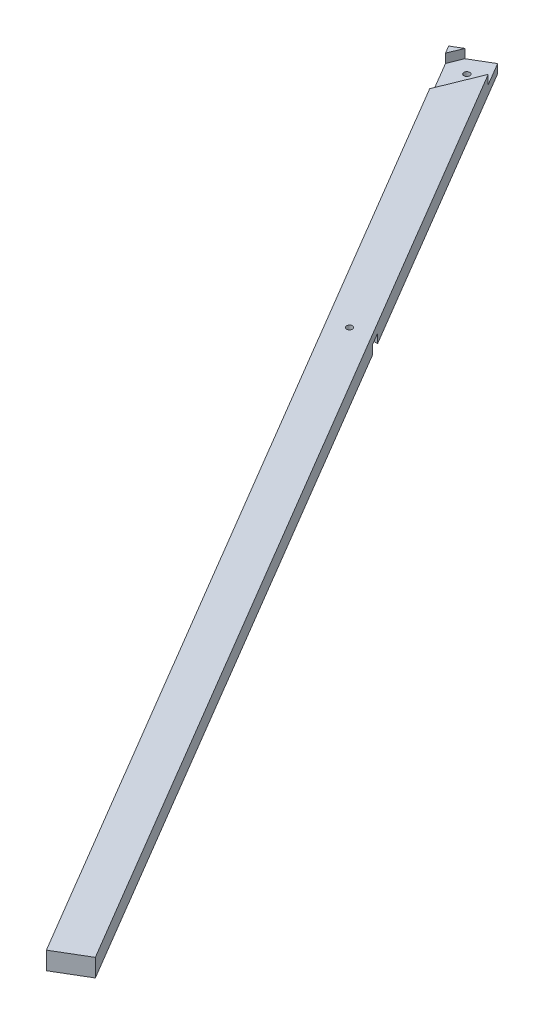
ISO-10303-21;
HEADER;
FILE_DESCRIPTION(('STEP AP214'),'2;1');
FILE_NAME('part.step','',(''),(''),'','','');
FILE_SCHEMA(('AUTOMOTIVE_DESIGN { 1 0 10303 214 1 1 1 1 }'));
ENDSEC;
DATA;
#1=APPLICATION_CONTEXT('core data for automotive mechanical design processes');
#2=APPLICATION_PROTOCOL_DEFINITION('international standard','automotive_design',2000,#1);
#3=PRODUCT_CONTEXT('',#1,'mechanical');
#4=PRODUCT('Part','Part','',(#3));
#5=PRODUCT_RELATED_PRODUCT_CATEGORY('part','',(#4));
#6=PRODUCT_DEFINITION_FORMATION('','',#4);
#7=PRODUCT_DEFINITION_CONTEXT('part definition',#1,'design');
#8=PRODUCT_DEFINITION('design','',#6,#7);
#9=PRODUCT_DEFINITION_SHAPE('','',#8);
#10=(LENGTH_UNIT() NAMED_UNIT(*) SI_UNIT(.MILLI.,.METRE.));
#11=(NAMED_UNIT(*) PLANE_ANGLE_UNIT() SI_UNIT($,.RADIAN.));
#12=(NAMED_UNIT(*) SI_UNIT($,.STERADIAN.) SOLID_ANGLE_UNIT());
#13=UNCERTAINTY_MEASURE_WITH_UNIT(LENGTH_MEASURE(1.E-05),#10,'distance_accuracy_value','');
#14=(GEOMETRIC_REPRESENTATION_CONTEXT(3) GLOBAL_UNCERTAINTY_ASSIGNED_CONTEXT((#13)) GLOBAL_UNIT_ASSIGNED_CONTEXT((#10,
#11,#12)) REPRESENTATION_CONTEXT('',''));
#15=CARTESIAN_POINT('',(0.,0.,0.));
#16=DIRECTION('',(0.,0.,1.));
#17=DIRECTION('',(1.,0.,0.));
#18=AXIS2_PLACEMENT_3D('',#15,#16,#17);
#19=CARTESIAN_POINT('',(0.,0.,0.));
#20=DIRECTION('',(0.,1.,0.));
#21=DIRECTION('',(0.,0.,1.));
#22=AXIS2_PLACEMENT_3D('',#19,#20,#21);
#23=PLANE('',#22);
#24=CARTESIAN_POINT('',(-200.025,0.,-287.053592554873));
#25=DIRECTION('',(0.,-1.,0.));
#26=DIRECTION('',(0.,0.,-1.));
#27=AXIS2_PLACEMENT_3D('',#24,#25,#26);
#28=CIRCLE('',#27,3.17500000000002);
#29=CARTESIAN_POINT('',(-200.025,0.,-290.228592554874));
#30=VERTEX_POINT('',#29);
#31=EDGE_CURVE('E234',#30,#30,#28,.T.);
#32=ORIENTED_EDGE('',*,*,#31,.F.);
#33=EDGE_LOOP('',(#32));
#34=FACE_BOUND('',#33,.T.);
#35=DIRECTION('',(-0.508928571428564,0.,-0.860808752966465));
#36=VECTOR('',#35,1.);
#37=CARTESIAN_POINT('',(0.,0.,13.8398518478836));
#38=LINE('',#37,#36);
#39=CARTESIAN_POINT('',(-8.18241683237236,0.,0.));
#40=VERTEX_POINT('',#39);
#41=CARTESIAN_POINT('',(-193.321682541703,0.,-313.147088584599));
#42=VERTEX_POINT('',#41);
#43=EDGE_CURVE('E225',#40,#42,#38,.T.);
#44=ORIENTED_EDGE('',*,*,#43,.F.);
#45=DIRECTION('',(1.,0.,0.));
#46=VECTOR('',#45,1.);
#47=CARTESIAN_POINT('',(-8.18241683237236,0.,0.));
#48=LINE('',#47,#46);
#49=CARTESIAN_POINT('',(-52.4431191878053,0.,0.));
#50=VERTEX_POINT('',#49);
#51=EDGE_CURVE('E136',#50,#40,#48,.T.);
#52=ORIENTED_EDGE('',*,*,#51,.F.);
#53=DIRECTION('',(0.508928571428569,0.,0.860808752966462));
#54=VECTOR('',#53,1.);
#55=CARTESIAN_POINT('',(-29.9175831676298,0.,38.1000000000001));
#56=LINE('',#55,#54);
#57=CARTESIAN_POINT('',(-226.118496029725,0.,-293.75691001317));
#58=VERTEX_POINT('',#57);
#59=EDGE_CURVE('E219',#58,#50,#56,.T.);
#60=ORIENTED_EDGE('',*,*,#59,.F.);
#61=DIRECTION('',(-0.860808752966463,0.,0.508928571428568));
#62=VECTOR('',#61,1.);
#63=CARTESIAN_POINT('',(-193.321682541703,0.,-313.147088584599));
#64=LINE('',#63,#62);
#65=EDGE_CURVE('E195',#42,#58,#64,.T.);
#66=ORIENTED_EDGE('',*,*,#65,.F.);
#67=EDGE_LOOP('',(#44,#52,#60,#66));
#68=FACE_BOUND('',#67,.T.);
#69=ADVANCED_FACE('F33',(#34,#68),#23,.F.);
#70=CARTESIAN_POINT('',(0.,19.05,0.));
#71=DIRECTION('',(0.,1.,0.));
#72=DIRECTION('',(0.,0.,1.));
#73=AXIS2_PLACEMENT_3D('',#70,#71,#72);
#74=PLANE('',#73);
#75=DIRECTION('',(-0.375000000000001,0.,0.927024810886958));
#76=VECTOR('',#75,1.);
#77=CARTESIAN_POINT('',(-289.345982904623,19.05,-117.046213127153));
#78=LINE('',#77,#76);
#79=CARTESIAN_POINT('',(-215.267964048959,19.05,-300.171976915291));
#80=VERTEX_POINT('',#79);
#81=CARTESIAN_POINT('',(-221.216787176876,19.05,-285.466092554874));
#82=VERTEX_POINT('',#81);
#83=EDGE_CURVE('E180',#80,#82,#78,.T.);
#84=ORIENTED_EDGE('',*,*,#83,.F.);
#85=DIRECTION('',(-0.860808752966463,0.,0.508928571428568));
#86=VECTOR('',#85,1.);
#87=CARTESIAN_POINT('',(-193.321682541703,19.05,-313.147088584599));
#88=LINE('',#87,#86);
#89=CARTESIAN_POINT('',(-226.118496029725,19.05,-293.75691001317));
#90=VERTEX_POINT('',#89);
#91=EDGE_CURVE('E205',#80,#90,#88,.T.);
#92=ORIENTED_EDGE('',*,*,#91,.T.);
#93=DIRECTION('',(0.508928571428569,0.,0.860808752966462));
#94=VECTOR('',#93,1.);
#95=CARTESIAN_POINT('',(-226.118496029725,19.05,-293.75691001317));
#96=LINE('',#95,#94);
#97=EDGE_CURVE('E209',#90,#82,#96,.T.);
#98=ORIENTED_EDGE('',*,*,#97,.T.);
#99=EDGE_LOOP('',(#84,#92,#98));
#100=FACE_BOUND('',#99,.T.);
#101=ADVANCED_FACE('F259',(#100),#74,.T.);
#102=CARTESIAN_POINT('',(-193.321682541703,19.05,-313.147088584599));
#103=DIRECTION('',(0.508928571428568,0.,0.860808752966463));
#104=DIRECTION('',(0.860808752966463,0.,-0.508928571428568));
#105=AXIS2_PLACEMENT_3D('',#102,#103,#104);
#106=PLANE('',#105);
#107=ORIENTED_EDGE('',*,*,#91,.F.);
#108=DIRECTION('',(0.,1.,0.));
#109=VECTOR('',#108,1.);
#110=CARTESIAN_POINT('',(-215.267964048959,9.525,-300.171976915291));
#111=LINE('',#110,#109);
#112=CARTESIAN_POINT('',(-215.267964048959,9.525,-300.171976915291));
#113=VERTEX_POINT('',#112);
#114=EDGE_CURVE('E196',#113,#80,#111,.T.);
#115=ORIENTED_EDGE('',*,*,#114,.F.);
#116=DIRECTION('',(-0.860808752966463,0.,0.508928571428568));
#117=VECTOR('',#116,1.);
#118=CARTESIAN_POINT('',(-187.25857950783,9.525,-316.73172495687));
#119=LINE('',#118,#117);
#120=CARTESIAN_POINT('',(-193.321682541703,9.525,-313.147088584599));
#121=VERTEX_POINT('',#120);
#122=EDGE_CURVE('E185',#121,#113,#119,.T.);
#123=ORIENTED_EDGE('',*,*,#122,.F.);
#124=DIRECTION('',(0.,-1.,0.));
#125=VECTOR('',#124,1.);
#126=CARTESIAN_POINT('',(-193.321682541703,19.05,-313.147088584599));
#127=LINE('',#126,#125);
#128=EDGE_CURVE('E11',#121,#42,#127,.T.);
#129=ORIENTED_EDGE('',*,*,#128,.T.);
#130=ORIENTED_EDGE('',*,*,#65,.T.);
#131=DIRECTION('',(0.,-1.,0.));
#132=VECTOR('',#131,1.);
#133=CARTESIAN_POINT('',(-226.118496029725,19.05,-293.75691001317));
#134=LINE('',#133,#132);
#135=EDGE_CURVE('E42',#90,#58,#134,.T.);
#136=ORIENTED_EDGE('',*,*,#135,.F.);
#137=EDGE_LOOP('',(#107,#115,#123,#129,#130,#136));
#138=FACE_BOUND('',#137,.T.);
#139=ADVANCED_FACE('F35',(#138),#106,.F.);
#140=CARTESIAN_POINT('',(-29.9175831676298,19.05,38.1000000000001));
#141=DIRECTION('',(0.860808752966462,0.,-0.508928571428569));
#142=DIRECTION('',(-0.508928571428569,0.,-0.860808752966462));
#143=AXIS2_PLACEMENT_3D('',#140,#141,#142);
#144=PLANE('',#143);
#145=ORIENTED_EDGE('',*,*,#59,.T.);
#146=DIRECTION('',(0.,-1.,0.));
#147=VECTOR('',#146,1.);
#148=CARTESIAN_POINT('',(-52.4431191878053,9.525,0.));
#149=LINE('',#148,#147);
#150=CARTESIAN_POINT('',(-52.4431191878053,9.525,0.));
#151=VERTEX_POINT('',#150);
#152=EDGE_CURVE('E167',#151,#50,#149,.T.);
#153=ORIENTED_EDGE('',*,*,#152,.F.);
#154=DIRECTION('',(-0.508928571428568,0.,-0.860808752966463));
#155=VECTOR('',#154,1.);
#156=CARTESIAN_POINT('',(-52.4431191878053,9.525,0.));
#157=LINE('',#156,#155);
#158=CARTESIAN_POINT('',(-29.9175831676298,9.525,38.1000000000001));
#159=VERTEX_POINT('',#158);
#160=EDGE_CURVE('E140',#159,#151,#157,.T.);
#161=ORIENTED_EDGE('',*,*,#160,.F.);
#162=DIRECTION('',(0.,-1.,0.));
#163=VECTOR('',#162,1.);
#164=CARTESIAN_POINT('',(-29.9175831676298,9.525,38.1000000000001));
#165=LINE('',#164,#163);
#166=CARTESIAN_POINT('',(-29.9175831676298,0.,38.1000000000001));
#167=VERTEX_POINT('',#166);
#168=EDGE_CURVE('E170',#159,#167,#165,.T.);
#169=ORIENTED_EDGE('',*,*,#168,.T.);
#170=CARTESIAN_POINT('',(394.367218255986,0.,755.741121603541));
#171=VERTEX_POINT('',#170);
#172=EDGE_CURVE('E218',#167,#171,#56,.T.);
#173=ORIENTED_EDGE('',*,*,#172,.T.);
#174=DIRECTION('',(0.,-1.,0.));
#175=VECTOR('',#174,1.);
#176=CARTESIAN_POINT('',(394.367218255986,19.05,755.741121603541));
#177=LINE('',#176,#175);
#178=CARTESIAN_POINT('',(394.367218255986,19.05,755.741121603541));
#179=VERTEX_POINT('',#178);
#180=EDGE_CURVE('E229',#179,#171,#177,.T.);
#181=ORIENTED_EDGE('',*,*,#180,.F.);
#182=CARTESIAN_POINT('',(-196.814123155019,19.05,-244.191092554873));
#183=VERTEX_POINT('',#182);
#184=EDGE_CURVE('E208',#183,#179,#96,.T.);
#185=ORIENTED_EDGE('',*,*,#184,.F.);
#186=DIRECTION('',(0.,1.,0.));
#187=VECTOR('',#186,1.);
#188=CARTESIAN_POINT('',(-196.814123155019,9.525,-244.191092554873));
#189=LINE('',#188,#187);
#190=CARTESIAN_POINT('',(-196.814123155019,9.525,-244.191092554873));
#191=VERTEX_POINT('',#190);
#192=EDGE_CURVE('E58',#191,#183,#189,.T.);
#193=ORIENTED_EDGE('',*,*,#192,.F.);
#194=DIRECTION('',(0.508928571428569,0.,0.860808752966462));
#195=VECTOR('',#194,1.);
#196=CARTESIAN_POINT('',(-38.8599165218951,9.525,22.9748149436999));
#197=LINE('',#196,#195);
#198=CARTESIAN_POINT('',(-221.216787176876,9.525,-285.466092554874));
#199=VERTEX_POINT('',#198);
#200=EDGE_CURVE('E176',#199,#191,#197,.T.);
#201=ORIENTED_EDGE('',*,*,#200,.F.);
#202=DIRECTION('',(0.,1.,0.));
#203=VECTOR('',#202,1.);
#204=CARTESIAN_POINT('',(-221.216787176876,9.525,-285.466092554874));
#205=LINE('',#204,#203);
#206=EDGE_CURVE('E192',#199,#82,#205,.T.);
#207=ORIENTED_EDGE('',*,*,#206,.T.);
#208=ORIENTED_EDGE('',*,*,#97,.F.);
#209=ORIENTED_EDGE('',*,*,#135,.T.);
#210=EDGE_LOOP('',(#145,#153,#161,#169,#173,#181,#185,#193,#201,#207,#208,#209));
#211=FACE_BOUND('',#210,.T.);
#212=ADVANCED_FACE('F285',(#211),#144,.F.);
#213=CARTESIAN_POINT('',(394.367218255986,19.05,755.741121603541));
#214=DIRECTION('',(-0.50892857142857,0.,-0.860808752966462));
#215=DIRECTION('',(-0.860808752966462,0.,0.50892857142857));
#216=AXIS2_PLACEMENT_3D('',#213,#214,#215);
#217=PLANE('',#216);
#218=DIRECTION('',(0.860808752966462,0.,-0.50892857142857));
#219=VECTOR('',#218,1.);
#220=CARTESIAN_POINT('',(394.367218255986,0.,755.741121603541));
#221=LINE('',#220,#219);
#222=CARTESIAN_POINT('',(427.164031744008,0.,736.350943032112));
#223=VERTEX_POINT('',#222);
#224=EDGE_CURVE('E222',#171,#223,#221,.T.);
#225=ORIENTED_EDGE('',*,*,#224,.T.);
#226=DIRECTION('',(0.,-1.,0.));
#227=VECTOR('',#226,1.);
#228=CARTESIAN_POINT('',(427.164031744008,19.05,736.350943032112));
#229=LINE('',#228,#227);
#230=CARTESIAN_POINT('',(427.164031744008,19.05,736.350943032112));
#231=VERTEX_POINT('',#230);
#232=EDGE_CURVE('E215',#231,#223,#229,.T.);
#233=ORIENTED_EDGE('',*,*,#232,.F.);
#234=DIRECTION('',(0.860808752966462,0.,-0.50892857142857));
#235=VECTOR('',#234,1.);
#236=CARTESIAN_POINT('',(394.367218255986,19.05,755.741121603541));
#237=LINE('',#236,#235);
#238=EDGE_CURVE('E212',#179,#231,#237,.T.);
#239=ORIENTED_EDGE('',*,*,#238,.F.);
#240=ORIENTED_EDGE('',*,*,#180,.T.);
#241=EDGE_LOOP('',(#225,#233,#239,#240));
#242=FACE_BOUND('',#241,.T.);
#243=ADVANCED_FACE('F289',(#242),#217,.F.);
#244=CARTESIAN_POINT('',(0.,19.05,13.8398518478836));
#245=DIRECTION('',(-0.860808752966465,0.,0.508928571428564));
#246=DIRECTION('',(0.508928571428564,0.,0.860808752966465));
#247=AXIS2_PLACEMENT_3D('',#244,#245,#246);
#248=PLANE('',#247);
#249=DIRECTION('',(0.508928571428564,0.,0.860808752966465));
#250=VECTOR('',#249,1.);
#251=CARTESIAN_POINT('',(0.,9.525,13.8398518478836));
#252=LINE('',#251,#250);
#253=CARTESIAN_POINT('',(-8.18241683237236,9.525,0.));
#254=VERTEX_POINT('',#253);
#255=CARTESIAN_POINT('',(0.,9.525,13.8398518478836));
#256=VERTEX_POINT('',#255);
#257=EDGE_CURVE('E146',#254,#256,#252,.T.);
#258=ORIENTED_EDGE('',*,*,#257,.F.);
#259=DIRECTION('',(0.,-1.,0.));
#260=VECTOR('',#259,1.);
#261=CARTESIAN_POINT('',(-8.18241683237236,9.525,0.));
#262=LINE('',#261,#260);
#263=EDGE_CURVE('E130',#254,#40,#262,.T.);
#264=ORIENTED_EDGE('',*,*,#263,.T.);
#265=ORIENTED_EDGE('',*,*,#43,.T.);
#266=ORIENTED_EDGE('',*,*,#128,.F.);
#267=DIRECTION('',(-0.508928571428569,0.,-0.860808752966462));
#268=VECTOR('',#267,1.);
#269=CARTESIAN_POINT('',(-6.0631030338729,9.525,3.58463637227139));
#270=LINE('',#269,#268);
#271=CARTESIAN_POINT('',(-178.833212823124,9.525,-288.641092554873));
#272=VERTEX_POINT('',#271);
#273=EDGE_CURVE('E183',#272,#121,#270,.T.);
#274=ORIENTED_EDGE('',*,*,#273,.F.);
#275=DIRECTION('',(0.,1.,0.));
#276=VECTOR('',#275,1.);
#277=CARTESIAN_POINT('',(-178.833212823124,9.525,-288.641092554873));
#278=LINE('',#277,#276);
#279=CARTESIAN_POINT('',(-178.833212823124,19.05,-288.641092554873));
#280=VERTEX_POINT('',#279);
#281=EDGE_CURVE('E198',#272,#280,#278,.T.);
#282=ORIENTED_EDGE('',*,*,#281,.T.);
#283=DIRECTION('',(-0.508928571428569,0.,-0.860808752966462));
#284=VECTOR('',#283,1.);
#285=CARTESIAN_POINT('',(-8.18241683237236,19.05,0.));
#286=LINE('',#285,#284);
#287=EDGE_CURVE('E202',#231,#280,#286,.T.);
#288=ORIENTED_EDGE('',*,*,#287,.F.);
#289=ORIENTED_EDGE('',*,*,#232,.T.);
#290=CARTESIAN_POINT('',(0.,0.,13.8398518478836));
#291=VERTEX_POINT('',#290);
#292=EDGE_CURVE('E206',#223,#291,#38,.T.);
#293=ORIENTED_EDGE('',*,*,#292,.T.);
#294=DIRECTION('',(0.,-1.,0.));
#295=VECTOR('',#294,1.);
#296=CARTESIAN_POINT('',(0.,9.525,13.8398518478836));
#297=LINE('',#296,#295);
#298=EDGE_CURVE('E50',#256,#291,#297,.T.);
#299=ORIENTED_EDGE('',*,*,#298,.F.);
#300=EDGE_LOOP('',(#258,#264,#265,#266,#274,#282,#288,#289,#293,#299));
#301=FACE_BOUND('',#300,.T.);
#302=ADVANCED_FACE('F152',(#301),#248,.F.);
#303=CARTESIAN_POINT('',(-19.05,19.05,19.05));
#304=DIRECTION('',(0.,-1.,0.));
#305=DIRECTION('',(0.,0.,-1.));
#306=AXIS2_PLACEMENT_3D('',#303,#304,#305);
#307=CIRCLE('',#306,3.175);
#308=CARTESIAN_POINT('',(-19.05,19.05,15.875));
#309=VERTEX_POINT('',#308);
#310=EDGE_CURVE('E241',#309,#309,#307,.T.);
#311=ORIENTED_EDGE('',*,*,#310,.T.);
#312=EDGE_LOOP('',(#311));
#313=FACE_BOUND('',#312,.T.);
#314=DIRECTION('',(0.375,0.,-0.927024810886958));
#315=VECTOR('',#314,1.);
#316=CARTESIAN_POINT('',(-254.02633760983,19.05,-102.758713127153));
#317=LINE('',#316,#315);
#318=EDGE_CURVE('E169',#183,#280,#317,.T.);
#319=ORIENTED_EDGE('',*,*,#318,.F.);
#320=ORIENTED_EDGE('',*,*,#184,.T.);
#321=ORIENTED_EDGE('',*,*,#238,.T.);
#322=ORIENTED_EDGE('',*,*,#287,.T.);
#323=EDGE_LOOP('',(#319,#320,#321,#322));
#324=FACE_BOUND('',#323,.T.);
#325=ADVANCED_FACE('F246',(#313,#324),#74,.T.);
#326=ORIENTED_EDGE('',*,*,#172,.F.);
#327=DIRECTION('',(-1.,0.,0.));
#328=VECTOR('',#327,1.);
#329=CARTESIAN_POINT('',(-29.9175831676298,0.,38.1000000000001));
#330=LINE('',#329,#328);
#331=CARTESIAN_POINT('',(0.,0.,38.1));
#332=VERTEX_POINT('',#331);
#333=EDGE_CURVE('E150',#332,#167,#330,.T.);
#334=ORIENTED_EDGE('',*,*,#333,.F.);
#335=DIRECTION('',(0.,0.,1.));
#336=VECTOR('',#335,1.);
#337=CARTESIAN_POINT('',(0.,0.,38.1));
#338=LINE('',#337,#336);
#339=EDGE_CURVE('E163',#291,#332,#338,.T.);
#340=ORIENTED_EDGE('',*,*,#339,.F.);
#341=ORIENTED_EDGE('',*,*,#292,.F.);
#342=ORIENTED_EDGE('',*,*,#224,.F.);
#343=EDGE_LOOP('',(#326,#334,#340,#341,#342));
#344=FACE_BOUND('',#343,.T.);
#345=ADVANCED_FACE('F262',(#344),#23,.F.);
#346=CARTESIAN_POINT('',(-289.345982904623,9.525,-117.046213127153));
#347=DIRECTION('',(-0.927024810886958,0.,-0.375000000000001));
#348=DIRECTION('',(-0.375000000000001,0.,0.927024810886958));
#349=AXIS2_PLACEMENT_3D('',#346,#347,#348);
#350=PLANE('',#349);
#351=ORIENTED_EDGE('',*,*,#83,.T.);
#352=ORIENTED_EDGE('',*,*,#206,.F.);
#353=DIRECTION('',(-0.375000000000001,0.,0.927024810886958));
#354=VECTOR('',#353,1.);
#355=CARTESIAN_POINT('',(-289.345982904623,9.525,-117.046213127153));
#356=LINE('',#355,#354);
#357=EDGE_CURVE('E187',#113,#199,#356,.T.);
#358=ORIENTED_EDGE('',*,*,#357,.F.);
#359=ORIENTED_EDGE('',*,*,#114,.T.);
#360=EDGE_LOOP('',(#351,#352,#358,#359));
#361=FACE_BOUND('',#360,.T.);
#362=ADVANCED_FACE('F271',(#361),#350,.F.);
#363=CARTESIAN_POINT('',(-254.02633760983,9.525,-102.758713127153));
#364=DIRECTION('',(0.927024810886958,0.,0.375));
#365=DIRECTION('',(0.375,0.,-0.927024810886958));
#366=AXIS2_PLACEMENT_3D('',#363,#364,#365);
#367=PLANE('',#366);
#368=ORIENTED_EDGE('',*,*,#318,.T.);
#369=ORIENTED_EDGE('',*,*,#281,.F.);
#370=DIRECTION('',(0.375,0.,-0.927024810886958));
#371=VECTOR('',#370,1.);
#372=CARTESIAN_POINT('',(-254.02633760983,9.525,-102.758713127153));
#373=LINE('',#372,#371);
#374=EDGE_CURVE('E179',#191,#272,#373,.T.);
#375=ORIENTED_EDGE('',*,*,#374,.F.);
#376=ORIENTED_EDGE('',*,*,#192,.T.);
#377=EDGE_LOOP('',(#368,#369,#375,#376));
#378=FACE_BOUND('',#377,.T.);
#379=ADVANCED_FACE('F277',(#378),#367,.F.);
#380=CARTESIAN_POINT('',(0.,9.525,0.));
#381=DIRECTION('',(0.,1.,0.));
#382=DIRECTION('',(0.,0.,1.));
#383=AXIS2_PLACEMENT_3D('',#380,#381,#382);
#384=PLANE('',#383);
#385=CARTESIAN_POINT('',(-200.025,9.525,-287.053592554873));
#386=DIRECTION('',(0.,1.,0.));
#387=DIRECTION('',(0.,0.,1.));
#388=AXIS2_PLACEMENT_3D('',#385,#386,#387);
#389=CIRCLE('',#388,3.17500000000002);
#390=CARTESIAN_POINT('',(-200.025,9.525,-290.228592554874));
#391=VERTEX_POINT('',#390);
#392=EDGE_CURVE('E164',#391,#391,#389,.T.);
#393=ORIENTED_EDGE('',*,*,#392,.F.);
#394=EDGE_LOOP('',(#393));
#395=FACE_BOUND('',#394,.T.);
#396=ORIENTED_EDGE('',*,*,#200,.T.);
#397=ORIENTED_EDGE('',*,*,#374,.T.);
#398=ORIENTED_EDGE('',*,*,#273,.T.);
#399=ORIENTED_EDGE('',*,*,#122,.T.);
#400=ORIENTED_EDGE('',*,*,#357,.T.);
#401=EDGE_LOOP('',(#396,#397,#398,#399,#400));
#402=FACE_BOUND('',#401,.T.);
#403=ADVANCED_FACE('F294',(#395,#402),#384,.T.);
#404=CARTESIAN_POINT('',(-8.18241683237236,9.525,0.));
#405=DIRECTION('',(0.,0.,-1.));
#406=DIRECTION('',(-1.,0.,0.));
#407=AXIS2_PLACEMENT_3D('',#404,#405,#406);
#408=PLANE('',#407);
#409=ORIENTED_EDGE('',*,*,#51,.T.);
#410=ORIENTED_EDGE('',*,*,#263,.F.);
#411=DIRECTION('',(1.,0.,0.));
#412=VECTOR('',#411,1.);
#413=CARTESIAN_POINT('',(-8.18241683237236,9.525,0.));
#414=LINE('',#413,#412);
#415=EDGE_CURVE('E133',#151,#254,#414,.T.);
#416=ORIENTED_EDGE('',*,*,#415,.F.);
#417=ORIENTED_EDGE('',*,*,#152,.T.);
#418=EDGE_LOOP('',(#409,#410,#416,#417));
#419=FACE_BOUND('',#418,.T.);
#420=ADVANCED_FACE('F132',(#419),#408,.F.);
#421=CARTESIAN_POINT('',(-29.9175831676298,9.525,38.1000000000001));
#422=DIRECTION('',(0.,0.,1.));
#423=DIRECTION('',(1.,0.,0.));
#424=AXIS2_PLACEMENT_3D('',#421,#422,#423);
#425=PLANE('',#424);
#426=ORIENTED_EDGE('',*,*,#333,.T.);
#427=ORIENTED_EDGE('',*,*,#168,.F.);
#428=DIRECTION('',(-1.,0.,0.));
#429=VECTOR('',#428,1.);
#430=CARTESIAN_POINT('',(-29.9175831676298,9.525,38.1000000000001));
#431=LINE('',#430,#429);
#432=CARTESIAN_POINT('',(0.,9.525,38.1));
#433=VERTEX_POINT('',#432);
#434=EDGE_CURVE('E156',#433,#159,#431,.T.);
#435=ORIENTED_EDGE('',*,*,#434,.F.);
#436=DIRECTION('',(0.,-1.,0.));
#437=VECTOR('',#436,1.);
#438=CARTESIAN_POINT('',(0.,9.525,38.1));
#439=LINE('',#438,#437);
#440=EDGE_CURVE('E173',#433,#332,#439,.T.);
#441=ORIENTED_EDGE('',*,*,#440,.T.);
#442=EDGE_LOOP('',(#426,#427,#435,#441));
#443=FACE_BOUND('',#442,.T.);
#444=ADVANCED_FACE('F315',(#443),#425,.F.);
#445=CARTESIAN_POINT('',(0.,9.525,38.1));
#446=DIRECTION('',(1.,0.,0.));
#447=DIRECTION('',(0.,0.,-1.));
#448=AXIS2_PLACEMENT_3D('',#445,#446,#447);
#449=PLANE('',#448);
#450=ORIENTED_EDGE('',*,*,#339,.T.);
#451=ORIENTED_EDGE('',*,*,#440,.F.);
#452=DIRECTION('',(0.,0.,1.));
#453=VECTOR('',#452,1.);
#454=CARTESIAN_POINT('',(0.,9.525,38.1));
#455=LINE('',#454,#453);
#456=EDGE_CURVE('E154',#256,#433,#455,.T.);
#457=ORIENTED_EDGE('',*,*,#456,.F.);
#458=ORIENTED_EDGE('',*,*,#298,.T.);
#459=EDGE_LOOP('',(#450,#451,#457,#458));
#460=FACE_BOUND('',#459,.T.);
#461=ADVANCED_FACE('F316',(#460),#449,.F.);
#462=CARTESIAN_POINT('',(0.,9.525,0.));
#463=DIRECTION('',(0.,-1.,0.));
#464=DIRECTION('',(0.,0.,-1.));
#465=AXIS2_PLACEMENT_3D('',#462,#463,#464);
#466=PLANE('',#465);
#467=CARTESIAN_POINT('',(-19.05,9.525,19.05));
#468=DIRECTION('',(0.,-1.,0.));
#469=DIRECTION('',(0.,0.,-1.));
#470=AXIS2_PLACEMENT_3D('',#467,#468,#469);
#471=CIRCLE('',#470,3.175);
#472=CARTESIAN_POINT('',(-19.05,9.525,15.875));
#473=VERTEX_POINT('',#472);
#474=EDGE_CURVE('E37',#473,#473,#471,.T.);
#475=ORIENTED_EDGE('',*,*,#474,.F.);
#476=EDGE_LOOP('',(#475));
#477=FACE_BOUND('',#476,.T.);
#478=ORIENTED_EDGE('',*,*,#415,.T.);
#479=ORIENTED_EDGE('',*,*,#257,.T.);
#480=ORIENTED_EDGE('',*,*,#456,.T.);
#481=ORIENTED_EDGE('',*,*,#434,.T.);
#482=ORIENTED_EDGE('',*,*,#160,.T.);
#483=EDGE_LOOP('',(#478,#479,#480,#481,#482));
#484=FACE_BOUND('',#483,.T.);
#485=ADVANCED_FACE('F144',(#477,#484),#466,.T.);
#486=CARTESIAN_POINT('',(-200.025,19.05,-287.053592554873));
#487=DIRECTION('',(0.,-1.,0.));
#488=DIRECTION('',(0.,0.,-1.));
#489=AXIS2_PLACEMENT_3D('',#486,#487,#488);
#490=CYLINDRICAL_SURFACE('',#489,3.17500000000002);
#491=CARTESIAN_POINT('',(-200.025,9.525,-290.228592554874));
#492=CARTESIAN_POINT('',(-200.025,9.42578125,-290.228592554874));
#493=CARTESIAN_POINT('',(-200.025,9.3265625,-290.228592554874));
#494=CARTESIAN_POINT('',(-200.025,9.128125,-290.228592554874));
#495=CARTESIAN_POINT('',(-200.025,9.02890625,-290.228592554874));
#496=CARTESIAN_POINT('',(-200.025,8.83046875,-290.228592554874));
#497=CARTESIAN_POINT('',(-200.025,8.73125,-290.228592554874));
#498=CARTESIAN_POINT('',(-200.025,8.5328125,-290.228592554874));
#499=CARTESIAN_POINT('',(-200.025,8.43359375,-290.228592554874));
#500=CARTESIAN_POINT('',(-200.025,8.23515625,-290.228592554874));
#501=CARTESIAN_POINT('',(-200.025,8.1359375,-290.228592554874));
#502=CARTESIAN_POINT('',(-200.025,7.9375,-290.228592554874));
#503=CARTESIAN_POINT('',(-200.025,7.83828125,-290.228592554874));
#504=CARTESIAN_POINT('',(-200.025,7.63984375,-290.228592554874));
#505=CARTESIAN_POINT('',(-200.025,7.540625,-290.228592554874));
#506=CARTESIAN_POINT('',(-200.025,7.3421875,-290.228592554874));
#507=CARTESIAN_POINT('',(-200.025,7.24296875,-290.228592554874));
#508=CARTESIAN_POINT('',(-200.025,7.04453125,-290.228592554874));
#509=CARTESIAN_POINT('',(-200.025,6.9453125,-290.228592554874));
#510=CARTESIAN_POINT('',(-200.025,6.746875,-290.228592554874));
#511=CARTESIAN_POINT('',(-200.025,6.64765625,-290.228592554874));
#512=CARTESIAN_POINT('',(-200.025,6.44921875,-290.228592554874));
#513=CARTESIAN_POINT('',(-200.025,6.35,-290.228592554874));
#514=CARTESIAN_POINT('',(-200.025,6.1515625,-290.228592554874));
#515=CARTESIAN_POINT('',(-200.025,6.05234375,-290.228592554874));
#516=CARTESIAN_POINT('',(-200.025,5.85390625,-290.228592554874));
#517=CARTESIAN_POINT('',(-200.025,5.7546875,-290.228592554874));
#518=CARTESIAN_POINT('',(-200.025,5.55625,-290.228592554874));
#519=CARTESIAN_POINT('',(-200.025,5.45703125,-290.228592554874));
#520=CARTESIAN_POINT('',(-200.025,5.25859375,-290.228592554874));
#521=CARTESIAN_POINT('',(-200.025,5.159375,-290.228592554874));
#522=CARTESIAN_POINT('',(-200.025,4.9609375,-290.228592554874));
#523=CARTESIAN_POINT('',(-200.025,4.86171875,-290.228592554874));
#524=CARTESIAN_POINT('',(-200.025,4.66328125,-290.228592554874));
#525=CARTESIAN_POINT('',(-200.025,4.5640625,-290.228592554874));
#526=CARTESIAN_POINT('',(-200.025,4.365625,-290.228592554874));
#527=CARTESIAN_POINT('',(-200.025,4.26640625,-290.228592554874));
#528=CARTESIAN_POINT('',(-200.025,4.06796875,-290.228592554874));
#529=CARTESIAN_POINT('',(-200.025,3.96875,-290.228592554874));
#530=CARTESIAN_POINT('',(-200.025,3.7703125,-290.228592554874));
#531=CARTESIAN_POINT('',(-200.025,3.67109375,-290.228592554874));
#532=CARTESIAN_POINT('',(-200.025,3.47265625,-290.228592554874));
#533=CARTESIAN_POINT('',(-200.025,3.3734375,-290.228592554874));
#534=CARTESIAN_POINT('',(-200.025,3.175,-290.228592554874));
#535=CARTESIAN_POINT('',(-200.025,3.07578125,-290.228592554874));
#536=CARTESIAN_POINT('',(-200.025,2.87734375,-290.228592554874));
#537=CARTESIAN_POINT('',(-200.025,2.778125,-290.228592554874));
#538=CARTESIAN_POINT('',(-200.025,2.5796875,-290.228592554874));
#539=CARTESIAN_POINT('',(-200.025,2.48046875,-290.228592554874));
#540=CARTESIAN_POINT('',(-200.025,2.28203125,-290.228592554874));
#541=CARTESIAN_POINT('',(-200.025,2.1828125,-290.228592554874));
#542=CARTESIAN_POINT('',(-200.025,1.984375,-290.228592554874));
#543=CARTESIAN_POINT('',(-200.025,1.88515625,-290.228592554874));
#544=CARTESIAN_POINT('',(-200.025,1.68671875,-290.228592554874));
#545=CARTESIAN_POINT('',(-200.025,1.5875,-290.228592554874));
#546=CARTESIAN_POINT('',(-200.025,1.3890625,-290.228592554874));
#547=CARTESIAN_POINT('',(-200.025,1.28984375,-290.228592554874));
#548=CARTESIAN_POINT('',(-200.025,1.09140625,-290.228592554874));
#549=CARTESIAN_POINT('',(-200.025,0.992187500000001,-290.228592554874));
#550=CARTESIAN_POINT('',(-200.025,0.793750000000001,-290.228592554874));
#551=CARTESIAN_POINT('',(-200.025,0.69453125,-290.228592554874));
#552=CARTESIAN_POINT('',(-200.025,0.49609375,-290.228592554874));
#553=CARTESIAN_POINT('',(-200.025,0.396875,-290.228592554874));
#554=CARTESIAN_POINT('',(-200.025,0.1984375,-290.228592554874));
#555=CARTESIAN_POINT('',(-200.025,0.0992187500000001,-290.228592554874));
#556=CARTESIAN_POINT('',(-200.025,0.,-290.228592554874));
#557=B_SPLINE_CURVE_WITH_KNOTS('',3,(#491,#492,#493,#494,#495,#496,#497,#498,#499,#500,#501,
#502,#503,#504,#505,#506,#507,#508,#509,#510,#511,#512,#513,#514,#515,#516,#517,#518,#519,#520,
#521,#522,#523,#524,#525,#526,#527,#528,#529,#530,#531,#532,#533,#534,#535,#536,#537,#538,#539,
#540,#541,#542,#543,#544,#545,#546,#547,#548,#549,#550,#551,#552,#553,#554,#555,#556),
.UNSPECIFIED.,.F.,.F.,(4,2,2,2,2,2,2,2,2,2,2,2,2,2,2,2,2,2,2,2,2,2,2,2,2,2,2,2,2,2,2,2,4),(0.,
0.29765625,0.5953125,0.892968750000001,1.190625,1.48828125,1.7859375,2.08359375,2.38125,
2.67890625,2.9765625,3.27421875,3.571875,3.86953125,4.1671875,4.46484375,4.7625,5.06015625,
5.3578125,5.65546875,5.953125,6.25078125,6.5484375,6.84609375,7.14375,7.44140625,7.7390625,
8.03671875,8.334375,8.63203125,8.9296875,9.22734375,9.525),.UNSPECIFIED.);
#558=EDGE_CURVE('BSEAM251',#391,#30,#557,.T.);
#559=ORIENTED_EDGE('',*,*,#392,.T.);
#560=ORIENTED_EDGE('',*,*,#31,.T.);
#561=ORIENTED_EDGE('',*,*,#558,.T.);
#562=ORIENTED_EDGE('',*,*,#558,.F.);
#563=EDGE_LOOP('',(#559,#561,#560,#562));
#564=FACE_BOUND('',#563,.T.);
#565=ADVANCED_FACE('F251',(#564),#490,.F.);
#566=CARTESIAN_POINT('',(-19.05,19.05,19.05));
#567=DIRECTION('',(0.,-1.,0.));
#568=DIRECTION('',(0.,0.,-1.));
#569=AXIS2_PLACEMENT_3D('',#566,#567,#568);
#570=CYLINDRICAL_SURFACE('',#569,3.175);
#571=CARTESIAN_POINT('',(-19.05,9.525,15.875));
#572=CARTESIAN_POINT('',(-19.05,9.62421875,15.875));
#573=CARTESIAN_POINT('',(-19.05,9.7234375,15.875));
#574=CARTESIAN_POINT('',(-19.05,9.921875,15.875));
#575=CARTESIAN_POINT('',(-19.05,10.02109375,15.875));
#576=CARTESIAN_POINT('',(-19.05,10.21953125,15.875));
#577=CARTESIAN_POINT('',(-19.05,10.31875,15.875));
#578=CARTESIAN_POINT('',(-19.05,10.5171875,15.875));
#579=CARTESIAN_POINT('',(-19.05,10.61640625,15.875));
#580=CARTESIAN_POINT('',(-19.05,10.81484375,15.875));
#581=CARTESIAN_POINT('',(-19.05,10.9140625,15.875));
#582=CARTESIAN_POINT('',(-19.05,11.1125,15.875));
#583=CARTESIAN_POINT('',(-19.05,11.21171875,15.875));
#584=CARTESIAN_POINT('',(-19.05,11.41015625,15.875));
#585=CARTESIAN_POINT('',(-19.05,11.509375,15.875));
#586=CARTESIAN_POINT('',(-19.05,11.7078125,15.875));
#587=CARTESIAN_POINT('',(-19.05,11.80703125,15.875));
#588=CARTESIAN_POINT('',(-19.05,12.00546875,15.875));
#589=CARTESIAN_POINT('',(-19.05,12.1046875,15.875));
#590=CARTESIAN_POINT('',(-19.05,12.303125,15.875));
#591=CARTESIAN_POINT('',(-19.05,12.40234375,15.875));
#592=CARTESIAN_POINT('',(-19.05,12.60078125,15.875));
#593=CARTESIAN_POINT('',(-19.05,12.7,15.875));
#594=CARTESIAN_POINT('',(-19.05,12.8984375,15.875));
#595=CARTESIAN_POINT('',(-19.05,12.99765625,15.875));
#596=CARTESIAN_POINT('',(-19.05,13.19609375,15.875));
#597=CARTESIAN_POINT('',(-19.05,13.2953125,15.875));
#598=CARTESIAN_POINT('',(-19.05,13.49375,15.875));
#599=CARTESIAN_POINT('',(-19.05,13.59296875,15.875));
#600=CARTESIAN_POINT('',(-19.05,13.79140625,15.875));
#601=CARTESIAN_POINT('',(-19.05,13.890625,15.875));
#602=CARTESIAN_POINT('',(-19.05,14.0890625,15.875));
#603=CARTESIAN_POINT('',(-19.05,14.18828125,15.875));
#604=CARTESIAN_POINT('',(-19.05,14.38671875,15.875));
#605=CARTESIAN_POINT('',(-19.05,14.4859375,15.875));
#606=CARTESIAN_POINT('',(-19.05,14.684375,15.875));
#607=CARTESIAN_POINT('',(-19.05,14.78359375,15.875));
#608=CARTESIAN_POINT('',(-19.05,14.98203125,15.875));
#609=CARTESIAN_POINT('',(-19.05,15.08125,15.875));
#610=CARTESIAN_POINT('',(-19.05,15.2796875,15.875));
#611=CARTESIAN_POINT('',(-19.05,15.37890625,15.875));
#612=CARTESIAN_POINT('',(-19.05,15.57734375,15.875));
#613=CARTESIAN_POINT('',(-19.05,15.6765625,15.875));
#614=CARTESIAN_POINT('',(-19.05,15.875,15.875));
#615=CARTESIAN_POINT('',(-19.05,15.97421875,15.875));
#616=CARTESIAN_POINT('',(-19.05,16.17265625,15.875));
#617=CARTESIAN_POINT('',(-19.05,16.271875,15.875));
#618=CARTESIAN_POINT('',(-19.05,16.4703125,15.875));
#619=CARTESIAN_POINT('',(-19.05,16.56953125,15.875));
#620=CARTESIAN_POINT('',(-19.05,16.76796875,15.875));
#621=CARTESIAN_POINT('',(-19.05,16.8671875,15.875));
#622=CARTESIAN_POINT('',(-19.05,17.065625,15.875));
#623=CARTESIAN_POINT('',(-19.05,17.16484375,15.875));
#624=CARTESIAN_POINT('',(-19.05,17.36328125,15.875));
#625=CARTESIAN_POINT('',(-19.05,17.4625,15.875));
#626=CARTESIAN_POINT('',(-19.05,17.6609375,15.875));
#627=CARTESIAN_POINT('',(-19.05,17.76015625,15.875));
#628=CARTESIAN_POINT('',(-19.05,17.95859375,15.875));
#629=CARTESIAN_POINT('',(-19.05,18.0578125,15.875));
#630=CARTESIAN_POINT('',(-19.05,18.25625,15.875));
#631=CARTESIAN_POINT('',(-19.05,18.35546875,15.875));
#632=CARTESIAN_POINT('',(-19.05,18.55390625,15.875));
#633=CARTESIAN_POINT('',(-19.05,18.653125,15.875));
#634=CARTESIAN_POINT('',(-19.05,18.8515625,15.875));
#635=CARTESIAN_POINT('',(-19.05,18.95078125,15.875));
#636=CARTESIAN_POINT('',(-19.05,19.05,15.875));
#637=B_SPLINE_CURVE_WITH_KNOTS('',3,(#571,#572,#573,#574,#575,#576,#577,#578,#579,#580,#581,
#582,#583,#584,#585,#586,#587,#588,#589,#590,#591,#592,#593,#594,#595,#596,#597,#598,#599,#600,
#601,#602,#603,#604,#605,#606,#607,#608,#609,#610,#611,#612,#613,#614,#615,#616,#617,#618,#619,
#620,#621,#622,#623,#624,#625,#626,#627,#628,#629,#630,#631,#632,#633,#634,#635,#636),
.UNSPECIFIED.,.F.,.F.,(4,2,2,2,2,2,2,2,2,2,2,2,2,2,2,2,2,2,2,2,2,2,2,2,2,2,2,2,2,2,2,2,4),(0.,
0.29765625,0.5953125,0.892968750000001,1.190625,1.48828125,1.7859375,2.08359375,2.38125,
2.67890625,2.9765625,3.27421875,3.571875,3.86953125,4.1671875,4.46484375,4.7625,5.06015625,
5.3578125,5.65546875,5.953125,6.25078125,6.5484375,6.84609375,7.14375,7.44140625,7.7390625,
8.03671875,8.334375,8.63203125,8.9296875,9.22734375,9.525),.UNSPECIFIED.);
#638=EDGE_CURVE('BSEAM249',#473,#309,#637,.T.);
#639=ORIENTED_EDGE('',*,*,#474,.T.);
#640=ORIENTED_EDGE('',*,*,#310,.F.);
#641=ORIENTED_EDGE('',*,*,#638,.T.);
#642=ORIENTED_EDGE('',*,*,#638,.F.);
#643=EDGE_LOOP('',(#639,#641,#640,#642));
#644=FACE_BOUND('',#643,.T.);
#645=ADVANCED_FACE('F249',(#644),#570,.F.);
#646=CLOSED_SHELL('',(#69,#101,#139,#212,#243,#302,#325,#345,#362,#379,#403,#420,#444,#461,#485,
#565,#645));
#647=MANIFOLD_SOLID_BREP('B2',#646);
#648=ADVANCED_BREP_SHAPE_REPRESENTATION('',(#18,#647),#14);
#649=SHAPE_DEFINITION_REPRESENTATION(#9,#648);
ENDSEC;
END-ISO-10303-21;
